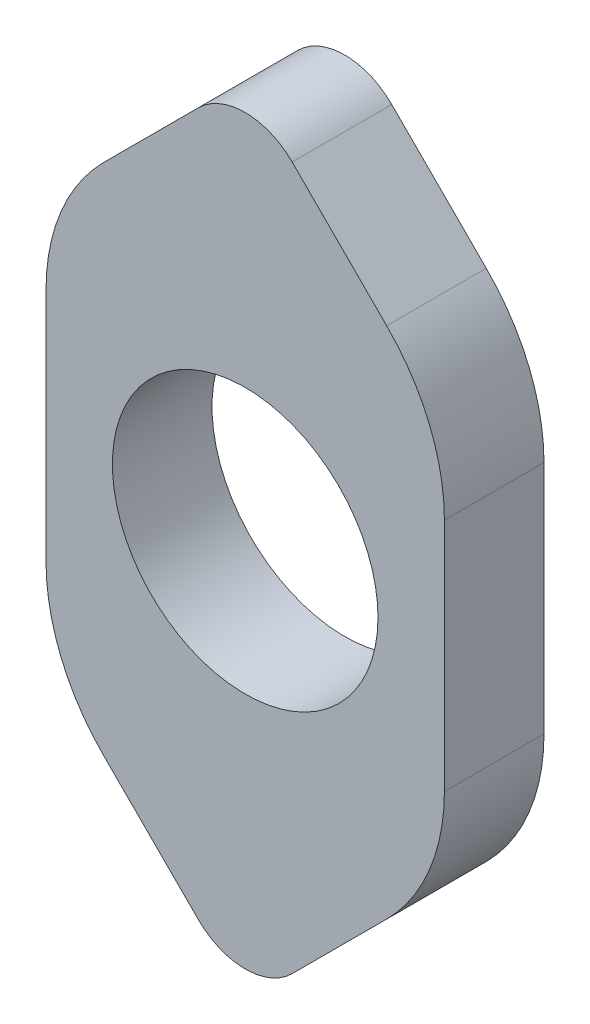
ISO-10303-21;
HEADER;
FILE_DESCRIPTION(('STEP AP214'),'2;1');
FILE_NAME('part.step','',(''),(''),'','','');
FILE_SCHEMA(('AUTOMOTIVE_DESIGN { 1 0 10303 214 1 1 1 1 }'));
ENDSEC;
DATA;
#1=APPLICATION_CONTEXT('core data for automotive mechanical design processes');
#2=APPLICATION_PROTOCOL_DEFINITION('international standard','automotive_design',2000,#1);
#3=PRODUCT_CONTEXT('',#1,'mechanical');
#4=PRODUCT('Part','Part','',(#3));
#5=PRODUCT_RELATED_PRODUCT_CATEGORY('part','',(#4));
#6=PRODUCT_DEFINITION_FORMATION('','',#4);
#7=PRODUCT_DEFINITION_CONTEXT('part definition',#1,'design');
#8=PRODUCT_DEFINITION('design','',#6,#7);
#9=PRODUCT_DEFINITION_SHAPE('','',#8);
#10=(LENGTH_UNIT() NAMED_UNIT(*) SI_UNIT(.MILLI.,.METRE.));
#11=(NAMED_UNIT(*) PLANE_ANGLE_UNIT() SI_UNIT($,.RADIAN.));
#12=(NAMED_UNIT(*) SI_UNIT($,.STERADIAN.) SOLID_ANGLE_UNIT());
#13=UNCERTAINTY_MEASURE_WITH_UNIT(LENGTH_MEASURE(1.E-05),#10,'distance_accuracy_value','');
#14=(GEOMETRIC_REPRESENTATION_CONTEXT(3) GLOBAL_UNCERTAINTY_ASSIGNED_CONTEXT((#13)) GLOBAL_UNIT_ASSIGNED_CONTEXT((#10,
#11,#12)) REPRESENTATION_CONTEXT('',''));
#15=CARTESIAN_POINT('',(0.,0.,0.));
#16=DIRECTION('',(0.,0.,1.));
#17=DIRECTION('',(1.,0.,0.));
#18=AXIS2_PLACEMENT_3D('',#15,#16,#17);
#19=CARTESIAN_POINT('',(1.16236175937676,3.49867626735791,0.75));
#20=DIRECTION('',(0.,0.,1.));
#21=DIRECTION('',(1.,0.,0.));
#22=AXIS2_PLACEMENT_3D('',#19,#20,#21);
#23=PLANE('',#22);
#24=CARTESIAN_POINT('',(1.16236175937676,3.49867626735791,0.75));
#25=DIRECTION('',(0.,0.,1.));
#26=DIRECTION('',(1.,0.,0.));
#27=AXIS2_PLACEMENT_3D('',#24,#25,#26);
#28=CIRCLE('',#27,1.);
#29=CARTESIAN_POINT('',(0.45525497819021,2.79156948617136,0.75));
#30=VERTEX_POINT('',#29);
#31=CARTESIAN_POINT('',(1.8694685405633,2.79156948617137,0.75));
#32=VERTEX_POINT('',#31);
#33=EDGE_CURVE('E191',#30,#32,#28,.T.);
#34=ORIENTED_EDGE('',*,*,#33,.T.);
#35=DIRECTION('',(0.707106781186547,0.707106781186548,0.));
#36=VECTOR('',#35,1.);
#37=CARTESIAN_POINT('',(1.8694685405633,2.79156948617137,0.75));
#38=LINE('',#37,#36);
#39=CARTESIAN_POINT('',(3.29274013081167,4.21484107641973,0.75));
#40=VERTEX_POINT('',#39);
#41=EDGE_CURVE('E119',#32,#40,#38,.T.);
#42=ORIENTED_EDGE('',*,*,#41,.T.);
#43=CARTESIAN_POINT('',(1.19328780099688,6.31429340623453,0.75));
#44=DIRECTION('',(0.,0.,1.));
#45=DIRECTION('',(1.,0.,0.));
#46=AXIS2_PLACEMENT_3D('',#43,#44,#45);
#47=CIRCLE('',#46,2.96907395837988);
#48=CARTESIAN_POINT('',(4.16236175937676,6.31429340623453,0.75));
#49=VERTEX_POINT('',#48);
#50=EDGE_CURVE('E218',#40,#49,#47,.T.);
#51=ORIENTED_EDGE('',*,*,#50,.T.);
#52=DIRECTION('',(0.,1.,0.));
#53=VECTOR('',#52,1.);
#54=CARTESIAN_POINT('',(4.16236175937676,9.85463200373509,0.75));
#55=LINE('',#54,#53);
#56=CARTESIAN_POINT('',(4.16236175937676,9.85463200373509,0.75));
#57=VERTEX_POINT('',#56);
#58=EDGE_CURVE('E237',#49,#57,#55,.T.);
#59=ORIENTED_EDGE('',*,*,#58,.T.);
#60=CARTESIAN_POINT('',(1.19328780099688,9.8546320037351,0.75));
#61=DIRECTION('',(0.,0.,1.));
#62=DIRECTION('',(-1.,0.,0.));
#63=AXIS2_PLACEMENT_3D('',#60,#61,#62);
#64=CIRCLE('',#63,2.96907395837988);
#65=CARTESIAN_POINT('',(3.29274013081167,11.9540843335499,0.75));
#66=VERTEX_POINT('',#65);
#67=EDGE_CURVE('E234',#57,#66,#64,.T.);
#68=ORIENTED_EDGE('',*,*,#67,.T.);
#69=DIRECTION('',(-0.707106781186548,0.707106781186547,0.));
#70=VECTOR('',#69,1.);
#71=CARTESIAN_POINT('',(1.8694685405633,13.3773559237983,0.75));
#72=LINE('',#71,#70);
#73=CARTESIAN_POINT('',(1.8694685405633,13.3773559237983,0.75));
#74=VERTEX_POINT('',#73);
#75=EDGE_CURVE('E236',#66,#74,#72,.T.);
#76=ORIENTED_EDGE('',*,*,#75,.T.);
#77=CARTESIAN_POINT('',(1.16236175937676,12.6702491426117,0.75));
#78=DIRECTION('',(0.,0.,1.));
#79=DIRECTION('',(1.,0.,0.));
#80=AXIS2_PLACEMENT_3D('',#77,#78,#79);
#81=CIRCLE('',#80,1.);
#82=CARTESIAN_POINT('',(0.45525497819021,13.3773559237983,0.75));
#83=VERTEX_POINT('',#82);
#84=EDGE_CURVE('E239',#74,#83,#81,.T.);
#85=ORIENTED_EDGE('',*,*,#84,.T.);
#86=DIRECTION('',(-0.707106781186547,-0.707106781186548,0.));
#87=VECTOR('',#86,1.);
#88=CARTESIAN_POINT('',(0.455254978190209,13.3773559237983,0.75));
#89=LINE('',#88,#87);
#90=CARTESIAN_POINT('',(-0.968016612058154,11.9540843335499,0.75));
#91=VERTEX_POINT('',#90);
#92=EDGE_CURVE('E245',#83,#91,#89,.T.);
#93=ORIENTED_EDGE('',*,*,#92,.T.);
#94=CARTESIAN_POINT('',(1.13143571775663,9.8546320037351,0.75));
#95=DIRECTION('',(0.,0.,1.));
#96=DIRECTION('',(-1.,0.,0.));
#97=AXIS2_PLACEMENT_3D('',#94,#95,#96);
#98=CIRCLE('',#97,2.96907395837988);
#99=CARTESIAN_POINT('',(-1.83763824062324,9.85463200373509,0.75));
#100=VERTEX_POINT('',#99);
#101=EDGE_CURVE('E150',#91,#100,#98,.T.);
#102=ORIENTED_EDGE('',*,*,#101,.T.);
#103=DIRECTION('',(0.,-1.,0.));
#104=VECTOR('',#103,1.);
#105=CARTESIAN_POINT('',(-1.83763824062324,9.85463200373509,0.75));
#106=LINE('',#105,#104);
#107=CARTESIAN_POINT('',(-1.83763824062324,6.31429340623454,0.75));
#108=VERTEX_POINT('',#107);
#109=EDGE_CURVE('E144',#100,#108,#106,.T.);
#110=ORIENTED_EDGE('',*,*,#109,.T.);
#111=CARTESIAN_POINT('',(1.13143571775663,6.31429340623453,0.75));
#112=DIRECTION('',(0.,0.,1.));
#113=DIRECTION('',(1.,0.,0.));
#114=AXIS2_PLACEMENT_3D('',#111,#112,#113);
#115=CIRCLE('',#114,2.96907395837988);
#116=CARTESIAN_POINT('',(-0.968016612058155,4.21484107641973,0.75));
#117=VERTEX_POINT('',#116);
#118=EDGE_CURVE('E148',#108,#117,#115,.T.);
#119=ORIENTED_EDGE('',*,*,#118,.T.);
#120=DIRECTION('',(0.707106781186547,-0.707106781186548,0.));
#121=VECTOR('',#120,1.);
#122=CARTESIAN_POINT('',(0.45525497819021,2.79156948617136,0.75));
#123=LINE('',#122,#121);
#124=EDGE_CURVE('E64',#117,#30,#123,.T.);
#125=ORIENTED_EDGE('',*,*,#124,.T.);
#126=EDGE_LOOP('',(#34,#42,#51,#59,#68,#76,#85,#93,#102,#110,#119,#125));
#127=FACE_BOUND('',#126,.T.);
#128=CARTESIAN_POINT('',(1.16236175937676,8.08446270498482,0.75));
#129=DIRECTION('',(0.,0.,1.));
#130=DIRECTION('',(1.,0.,0.));
#131=AXIS2_PLACEMENT_3D('',#128,#129,#130);
#132=CIRCLE('',#131,2.);
#133=CARTESIAN_POINT('',(3.16236175937676,8.08446270498482,0.75));
#134=VERTEX_POINT('',#133);
#135=EDGE_CURVE('E172',#134,#134,#132,.T.);
#136=ORIENTED_EDGE('',*,*,#135,.F.);
#137=EDGE_LOOP('',(#136));
#138=FACE_BOUND('',#137,.T.);
#139=ADVANCED_FACE('F47',(#127,#138),#23,.T.);
#140=CARTESIAN_POINT('',(1.16236175937676,3.49867626735791,-0.75));
#141=DIRECTION('',(0.,0.,1.));
#142=DIRECTION('',(1.,0.,0.));
#143=AXIS2_PLACEMENT_3D('',#140,#141,#142);
#144=PLANE('',#143);
#145=CARTESIAN_POINT('',(1.16236175937676,3.49867626735791,-0.75));
#146=DIRECTION('',(0.,0.,1.));
#147=DIRECTION('',(1.,0.,0.));
#148=AXIS2_PLACEMENT_3D('',#145,#146,#147);
#149=CIRCLE('',#148,1.);
#150=CARTESIAN_POINT('',(0.45525497819021,2.79156948617136,-0.75));
#151=VERTEX_POINT('',#150);
#152=CARTESIAN_POINT('',(1.8694685405633,2.79156948617137,-0.75));
#153=VERTEX_POINT('',#152);
#154=EDGE_CURVE('E168',#151,#153,#149,.T.);
#155=ORIENTED_EDGE('',*,*,#154,.F.);
#156=DIRECTION('',(0.707106781186547,-0.707106781186548,0.));
#157=VECTOR('',#156,1.);
#158=CARTESIAN_POINT('',(0.45525497819021,2.79156948617136,-0.75));
#159=LINE('',#158,#157);
#160=CARTESIAN_POINT('',(-0.968016612058155,4.21484107641973,-0.75));
#161=VERTEX_POINT('',#160);
#162=EDGE_CURVE('E111',#161,#151,#159,.T.);
#163=ORIENTED_EDGE('',*,*,#162,.F.);
#164=CARTESIAN_POINT('',(1.13143571775663,6.31429340623453,-0.75));
#165=DIRECTION('',(0.,0.,1.));
#166=DIRECTION('',(1.,0.,0.));
#167=AXIS2_PLACEMENT_3D('',#164,#165,#166);
#168=CIRCLE('',#167,2.96907395837988);
#169=CARTESIAN_POINT('',(-1.83763824062324,6.31429340623454,-0.75));
#170=VERTEX_POINT('',#169);
#171=EDGE_CURVE('E105',#170,#161,#168,.T.);
#172=ORIENTED_EDGE('',*,*,#171,.F.);
#173=DIRECTION('',(0.,-1.,0.));
#174=VECTOR('',#173,1.);
#175=CARTESIAN_POINT('',(-1.83763824062324,9.85463200373509,-0.75));
#176=LINE('',#175,#174);
#177=CARTESIAN_POINT('',(-1.83763824062324,9.85463200373509,-0.75));
#178=VERTEX_POINT('',#177);
#179=EDGE_CURVE('E158',#178,#170,#176,.T.);
#180=ORIENTED_EDGE('',*,*,#179,.F.);
#181=CARTESIAN_POINT('',(1.13143571775663,9.8546320037351,-0.75));
#182=DIRECTION('',(0.,0.,1.));
#183=DIRECTION('',(-1.,0.,0.));
#184=AXIS2_PLACEMENT_3D('',#181,#182,#183);
#185=CIRCLE('',#184,2.96907395837988);
#186=CARTESIAN_POINT('',(-0.968016612058154,11.9540843335499,-0.75));
#187=VERTEX_POINT('',#186);
#188=EDGE_CURVE('E186',#187,#178,#185,.T.);
#189=ORIENTED_EDGE('',*,*,#188,.F.);
#190=DIRECTION('',(-0.707106781186547,-0.707106781186548,0.));
#191=VECTOR('',#190,1.);
#192=CARTESIAN_POINT('',(0.455254978190209,13.3773559237983,-0.75));
#193=LINE('',#192,#191);
#194=CARTESIAN_POINT('',(0.45525497819021,13.3773559237983,-0.75));
#195=VERTEX_POINT('',#194);
#196=EDGE_CURVE('E184',#195,#187,#193,.T.);
#197=ORIENTED_EDGE('',*,*,#196,.F.);
#198=CARTESIAN_POINT('',(1.16236175937676,12.6702491426117,-0.75));
#199=DIRECTION('',(0.,0.,1.));
#200=DIRECTION('',(1.,0.,0.));
#201=AXIS2_PLACEMENT_3D('',#198,#199,#200);
#202=CIRCLE('',#201,1.);
#203=CARTESIAN_POINT('',(1.8694685405633,13.3773559237983,-0.75));
#204=VERTEX_POINT('',#203);
#205=EDGE_CURVE('E182',#204,#195,#202,.T.);
#206=ORIENTED_EDGE('',*,*,#205,.F.);
#207=DIRECTION('',(-0.707106781186548,0.707106781186547,0.));
#208=VECTOR('',#207,1.);
#209=CARTESIAN_POINT('',(1.8694685405633,13.3773559237983,-0.75));
#210=LINE('',#209,#208);
#211=CARTESIAN_POINT('',(3.29274013081167,11.9540843335499,-0.75));
#212=VERTEX_POINT('',#211);
#213=EDGE_CURVE('E180',#212,#204,#210,.T.);
#214=ORIENTED_EDGE('',*,*,#213,.F.);
#215=CARTESIAN_POINT('',(1.19328780099688,9.8546320037351,-0.75));
#216=DIRECTION('',(0.,0.,1.));
#217=DIRECTION('',(-1.,0.,0.));
#218=AXIS2_PLACEMENT_3D('',#215,#216,#217);
#219=CIRCLE('',#218,2.96907395837988);
#220=CARTESIAN_POINT('',(4.16236175937676,9.85463200373509,-0.75));
#221=VERTEX_POINT('',#220);
#222=EDGE_CURVE('E178',#221,#212,#219,.T.);
#223=ORIENTED_EDGE('',*,*,#222,.F.);
#224=DIRECTION('',(0.,1.,0.));
#225=VECTOR('',#224,1.);
#226=CARTESIAN_POINT('',(4.16236175937676,9.85463200373509,-0.75));
#227=LINE('',#226,#225);
#228=CARTESIAN_POINT('',(4.16236175937676,6.31429340623453,-0.75));
#229=VERTEX_POINT('',#228);
#230=EDGE_CURVE('E176',#229,#221,#227,.T.);
#231=ORIENTED_EDGE('',*,*,#230,.F.);
#232=CARTESIAN_POINT('',(1.19328780099688,6.31429340623453,-0.75));
#233=DIRECTION('',(0.,0.,1.));
#234=DIRECTION('',(1.,0.,0.));
#235=AXIS2_PLACEMENT_3D('',#232,#233,#234);
#236=CIRCLE('',#235,2.96907395837988);
#237=CARTESIAN_POINT('',(3.29274013081167,4.21484107641973,-0.75));
#238=VERTEX_POINT('',#237);
#239=EDGE_CURVE('E174',#238,#229,#236,.T.);
#240=ORIENTED_EDGE('',*,*,#239,.F.);
#241=DIRECTION('',(0.707106781186547,0.707106781186548,0.));
#242=VECTOR('',#241,1.);
#243=CARTESIAN_POINT('',(1.8694685405633,2.79156948617137,-0.75));
#244=LINE('',#243,#242);
#245=EDGE_CURVE('E171',#153,#238,#244,.T.);
#246=ORIENTED_EDGE('',*,*,#245,.F.);
#247=EDGE_LOOP('',(#155,#163,#172,#180,#189,#197,#206,#214,#223,#231,#240,#246));
#248=FACE_BOUND('',#247,.T.);
#249=CARTESIAN_POINT('',(1.16236175937676,8.08446270498482,-0.75));
#250=DIRECTION('',(0.,0.,1.));
#251=DIRECTION('',(1.,0.,0.));
#252=AXIS2_PLACEMENT_3D('',#249,#250,#251);
#253=CIRCLE('',#252,2.);
#254=CARTESIAN_POINT('',(3.16236175937676,8.08446270498482,-0.75));
#255=VERTEX_POINT('',#254);
#256=EDGE_CURVE('E394',#255,#255,#253,.T.);
#257=ORIENTED_EDGE('',*,*,#256,.T.);
#258=EDGE_LOOP('',(#257));
#259=FACE_BOUND('',#258,.T.);
#260=ADVANCED_FACE('F222',(#248,#259),#144,.F.);
#261=CARTESIAN_POINT('',(1.16236175937676,3.49867626735791,0.75));
#262=DIRECTION('',(0.,0.,-1.));
#263=DIRECTION('',(-1.,0.,0.));
#264=AXIS2_PLACEMENT_3D('',#261,#262,#263);
#265=CYLINDRICAL_SURFACE('',#264,1.);
#266=ORIENTED_EDGE('',*,*,#154,.T.);
#267=DIRECTION('',(0.,0.,-1.));
#268=VECTOR('',#267,1.);
#269=CARTESIAN_POINT('',(1.8694685405633,2.79156948617137,0.75));
#270=LINE('',#269,#268);
#271=EDGE_CURVE('E13',#32,#153,#270,.T.);
#272=ORIENTED_EDGE('',*,*,#271,.F.);
#273=ORIENTED_EDGE('',*,*,#33,.F.);
#274=DIRECTION('',(0.,0.,-1.));
#275=VECTOR('',#274,1.);
#276=CARTESIAN_POINT('',(0.45525497819021,2.79156948617136,0.75));
#277=LINE('',#276,#275);
#278=EDGE_CURVE('E164',#30,#151,#277,.T.);
#279=ORIENTED_EDGE('',*,*,#278,.T.);
#280=EDGE_LOOP('',(#266,#272,#273,#279));
#281=FACE_BOUND('',#280,.T.);
#282=ADVANCED_FACE('F49',(#281),#265,.T.);
#283=CARTESIAN_POINT('',(1.8694685405633,2.79156948617137,0.75));
#284=DIRECTION('',(-0.707106781186548,0.707106781186547,0.));
#285=DIRECTION('',(-0.707106781186547,-0.707106781186548,0.));
#286=AXIS2_PLACEMENT_3D('',#283,#284,#285);
#287=PLANE('',#286);
#288=ORIENTED_EDGE('',*,*,#245,.T.);
#289=DIRECTION('',(0.,0.,-1.));
#290=VECTOR('',#289,1.);
#291=CARTESIAN_POINT('',(3.29274013081167,4.21484107641973,0.75));
#292=LINE('',#291,#290);
#293=EDGE_CURVE('E56',#40,#238,#292,.T.);
#294=ORIENTED_EDGE('',*,*,#293,.F.);
#295=ORIENTED_EDGE('',*,*,#41,.F.);
#296=ORIENTED_EDGE('',*,*,#271,.T.);
#297=EDGE_LOOP('',(#288,#294,#295,#296));
#298=FACE_BOUND('',#297,.T.);
#299=ADVANCED_FACE('F279',(#298),#287,.F.);
#300=CARTESIAN_POINT('',(1.19328780099688,6.31429340623453,0.75));
#301=DIRECTION('',(0.,0.,-1.));
#302=DIRECTION('',(-1.,0.,0.));
#303=AXIS2_PLACEMENT_3D('',#300,#301,#302);
#304=CYLINDRICAL_SURFACE('',#303,2.96907395837988);
#305=ORIENTED_EDGE('',*,*,#239,.T.);
#306=DIRECTION('',(0.,0.,-1.));
#307=VECTOR('',#306,1.);
#308=CARTESIAN_POINT('',(4.16236175937676,6.31429340623453,0.75));
#309=LINE('',#308,#307);
#310=EDGE_CURVE('E210',#49,#229,#309,.T.);
#311=ORIENTED_EDGE('',*,*,#310,.F.);
#312=ORIENTED_EDGE('',*,*,#50,.F.);
#313=ORIENTED_EDGE('',*,*,#293,.T.);
#314=EDGE_LOOP('',(#305,#311,#312,#313));
#315=FACE_BOUND('',#314,.T.);
#316=ADVANCED_FACE('F216',(#315),#304,.T.);
#317=CARTESIAN_POINT('',(4.16236175937676,9.85463200373509,0.75));
#318=DIRECTION('',(-1.,0.,0.));
#319=DIRECTION('',(0.,0.,1.));
#320=AXIS2_PLACEMENT_3D('',#317,#318,#319);
#321=PLANE('',#320);
#322=ORIENTED_EDGE('',*,*,#230,.T.);
#323=DIRECTION('',(0.,0.,-1.));
#324=VECTOR('',#323,1.);
#325=CARTESIAN_POINT('',(4.16236175937676,9.85463200373509,0.75));
#326=LINE('',#325,#324);
#327=EDGE_CURVE('E207',#57,#221,#326,.T.);
#328=ORIENTED_EDGE('',*,*,#327,.F.);
#329=ORIENTED_EDGE('',*,*,#58,.F.);
#330=ORIENTED_EDGE('',*,*,#310,.T.);
#331=EDGE_LOOP('',(#322,#328,#329,#330));
#332=FACE_BOUND('',#331,.T.);
#333=ADVANCED_FACE('F228',(#332),#321,.F.);
#334=CARTESIAN_POINT('',(1.19328780099688,9.8546320037351,0.75));
#335=DIRECTION('',(0.,0.,-1.));
#336=DIRECTION('',(-1.,0.,0.));
#337=AXIS2_PLACEMENT_3D('',#334,#335,#336);
#338=CYLINDRICAL_SURFACE('',#337,2.96907395837988);
#339=ORIENTED_EDGE('',*,*,#222,.T.);
#340=DIRECTION('',(0.,0.,-1.));
#341=VECTOR('',#340,1.);
#342=CARTESIAN_POINT('',(3.29274013081167,11.9540843335499,0.75));
#343=LINE('',#342,#341);
#344=EDGE_CURVE('E204',#66,#212,#343,.T.);
#345=ORIENTED_EDGE('',*,*,#344,.F.);
#346=ORIENTED_EDGE('',*,*,#67,.F.);
#347=ORIENTED_EDGE('',*,*,#327,.T.);
#348=EDGE_LOOP('',(#339,#345,#346,#347));
#349=FACE_BOUND('',#348,.T.);
#350=ADVANCED_FACE('F232',(#349),#338,.T.);
#351=CARTESIAN_POINT('',(1.8694685405633,13.3773559237983,0.75));
#352=DIRECTION('',(-0.707106781186547,-0.707106781186548,0.));
#353=DIRECTION('',(0.707106781186548,-0.707106781186547,0.));
#354=AXIS2_PLACEMENT_3D('',#351,#352,#353);
#355=PLANE('',#354);
#356=ORIENTED_EDGE('',*,*,#213,.T.);
#357=DIRECTION('',(0.,0.,-1.));
#358=VECTOR('',#357,1.);
#359=CARTESIAN_POINT('',(1.8694685405633,13.3773559237983,0.75));
#360=LINE('',#359,#358);
#361=EDGE_CURVE('E201',#74,#204,#360,.T.);
#362=ORIENTED_EDGE('',*,*,#361,.F.);
#363=ORIENTED_EDGE('',*,*,#75,.F.);
#364=ORIENTED_EDGE('',*,*,#344,.T.);
#365=EDGE_LOOP('',(#356,#362,#363,#364));
#366=FACE_BOUND('',#365,.T.);
#367=ADVANCED_FACE('F292',(#366),#355,.F.);
#368=CARTESIAN_POINT('',(1.16236175937676,12.6702491426117,0.75));
#369=DIRECTION('',(0.,0.,-1.));
#370=DIRECTION('',(-1.,0.,0.));
#371=AXIS2_PLACEMENT_3D('',#368,#369,#370);
#372=CYLINDRICAL_SURFACE('',#371,1.);
#373=ORIENTED_EDGE('',*,*,#205,.T.);
#374=DIRECTION('',(0.,0.,-1.));
#375=VECTOR('',#374,1.);
#376=CARTESIAN_POINT('',(0.45525497819021,13.3773559237983,0.75));
#377=LINE('',#376,#375);
#378=EDGE_CURVE('E198',#83,#195,#377,.T.);
#379=ORIENTED_EDGE('',*,*,#378,.F.);
#380=ORIENTED_EDGE('',*,*,#84,.F.);
#381=ORIENTED_EDGE('',*,*,#361,.T.);
#382=EDGE_LOOP('',(#373,#379,#380,#381));
#383=FACE_BOUND('',#382,.T.);
#384=ADVANCED_FACE('F295',(#383),#372,.T.);
#385=CARTESIAN_POINT('',(0.455254978190209,13.3773559237983,0.75));
#386=DIRECTION('',(0.707106781186548,-0.707106781186547,0.));
#387=DIRECTION('',(0.707106781186547,0.707106781186548,0.));
#388=AXIS2_PLACEMENT_3D('',#385,#386,#387);
#389=PLANE('',#388);
#390=ORIENTED_EDGE('',*,*,#196,.T.);
#391=DIRECTION('',(0.,0.,-1.));
#392=VECTOR('',#391,1.);
#393=CARTESIAN_POINT('',(-0.968016612058154,11.9540843335499,0.75));
#394=LINE('',#393,#392);
#395=EDGE_CURVE('E195',#91,#187,#394,.T.);
#396=ORIENTED_EDGE('',*,*,#395,.F.);
#397=ORIENTED_EDGE('',*,*,#92,.F.);
#398=ORIENTED_EDGE('',*,*,#378,.T.);
#399=EDGE_LOOP('',(#390,#396,#397,#398));
#400=FACE_BOUND('',#399,.T.);
#401=ADVANCED_FACE('F251',(#400),#389,.F.);
#402=CARTESIAN_POINT('',(1.13143571775663,9.8546320037351,0.75));
#403=DIRECTION('',(0.,0.,-1.));
#404=DIRECTION('',(-1.,0.,0.));
#405=AXIS2_PLACEMENT_3D('',#402,#403,#404);
#406=CYLINDRICAL_SURFACE('',#405,2.96907395837988);
#407=ORIENTED_EDGE('',*,*,#188,.T.);
#408=DIRECTION('',(0.,0.,-1.));
#409=VECTOR('',#408,1.);
#410=CARTESIAN_POINT('',(-1.83763824062324,9.85463200373509,0.75));
#411=LINE('',#410,#409);
#412=EDGE_CURVE('E159',#100,#178,#411,.T.);
#413=ORIENTED_EDGE('',*,*,#412,.F.);
#414=ORIENTED_EDGE('',*,*,#101,.F.);
#415=ORIENTED_EDGE('',*,*,#395,.T.);
#416=EDGE_LOOP('',(#407,#413,#414,#415));
#417=FACE_BOUND('',#416,.T.);
#418=ADVANCED_FACE('F255',(#417),#406,.T.);
#419=CARTESIAN_POINT('',(-1.83763824062324,9.85463200373509,0.75));
#420=DIRECTION('',(1.,0.,0.));
#421=DIRECTION('',(0.,1.,0.));
#422=AXIS2_PLACEMENT_3D('',#419,#420,#421);
#423=PLANE('',#422);
#424=ORIENTED_EDGE('',*,*,#179,.T.);
#425=DIRECTION('',(0.,0.,-1.));
#426=VECTOR('',#425,1.);
#427=CARTESIAN_POINT('',(-1.83763824062324,6.31429340623454,0.75));
#428=LINE('',#427,#426);
#429=EDGE_CURVE('E155',#108,#170,#428,.T.);
#430=ORIENTED_EDGE('',*,*,#429,.F.);
#431=ORIENTED_EDGE('',*,*,#109,.F.);
#432=ORIENTED_EDGE('',*,*,#412,.T.);
#433=EDGE_LOOP('',(#424,#430,#431,#432));
#434=FACE_BOUND('',#433,.T.);
#435=ADVANCED_FACE('F156',(#434),#423,.F.);
#436=CARTESIAN_POINT('',(1.13143571775663,6.31429340623453,0.75));
#437=DIRECTION('',(0.,0.,-1.));
#438=DIRECTION('',(-1.,0.,0.));
#439=AXIS2_PLACEMENT_3D('',#436,#437,#438);
#440=CYLINDRICAL_SURFACE('',#439,2.96907395837988);
#441=ORIENTED_EDGE('',*,*,#171,.T.);
#442=DIRECTION('',(0.,0.,-1.));
#443=VECTOR('',#442,1.);
#444=CARTESIAN_POINT('',(-0.968016612058155,4.21484107641973,0.75));
#445=LINE('',#444,#443);
#446=EDGE_CURVE('E160',#117,#161,#445,.T.);
#447=ORIENTED_EDGE('',*,*,#446,.F.);
#448=ORIENTED_EDGE('',*,*,#118,.F.);
#449=ORIENTED_EDGE('',*,*,#429,.T.);
#450=EDGE_LOOP('',(#441,#447,#448,#449));
#451=FACE_BOUND('',#450,.T.);
#452=ADVANCED_FACE('F162',(#451),#440,.T.);
#453=CARTESIAN_POINT('',(0.45525497819021,2.79156948617136,0.75));
#454=DIRECTION('',(0.707106781186548,0.707106781186547,0.));
#455=DIRECTION('',(-0.707106781186547,0.707106781186548,0.));
#456=AXIS2_PLACEMENT_3D('',#453,#454,#455);
#457=PLANE('',#456);
#458=ORIENTED_EDGE('',*,*,#162,.T.);
#459=ORIENTED_EDGE('',*,*,#278,.F.);
#460=ORIENTED_EDGE('',*,*,#124,.F.);
#461=ORIENTED_EDGE('',*,*,#446,.T.);
#462=EDGE_LOOP('',(#458,#459,#460,#461));
#463=FACE_BOUND('',#462,.T.);
#464=ADVANCED_FACE('F259',(#463),#457,.F.);
#465=CARTESIAN_POINT('',(1.16236175937676,8.08446270498482,0.75));
#466=DIRECTION('',(0.,0.,-1.));
#467=DIRECTION('',(-1.,0.,0.));
#468=AXIS2_PLACEMENT_3D('',#465,#466,#467);
#469=CYLINDRICAL_SURFACE('',#468,2.);
#470=ORIENTED_EDGE('',*,*,#135,.T.);
#471=EDGE_LOOP('',(#470));
#472=FACE_BOUND('',#471,.T.);
#473=ORIENTED_EDGE('',*,*,#256,.F.);
#474=EDGE_LOOP('',(#473));
#475=FACE_BOUND('',#474,.T.);
#476=ADVANCED_FACE('F261',(#472,#475),#469,.F.);
#477=CLOSED_SHELL('',(#139,#260,#282,#299,#316,#333,#350,#367,#384,#401,#418,#435,#452,#464,#476));
#478=MANIFOLD_SOLID_BREP('B2',#477);
#479=ADVANCED_BREP_SHAPE_REPRESENTATION('',(#18,#478),#14);
#480=SHAPE_DEFINITION_REPRESENTATION(#9,#479);
ENDSEC;
END-ISO-10303-21;
